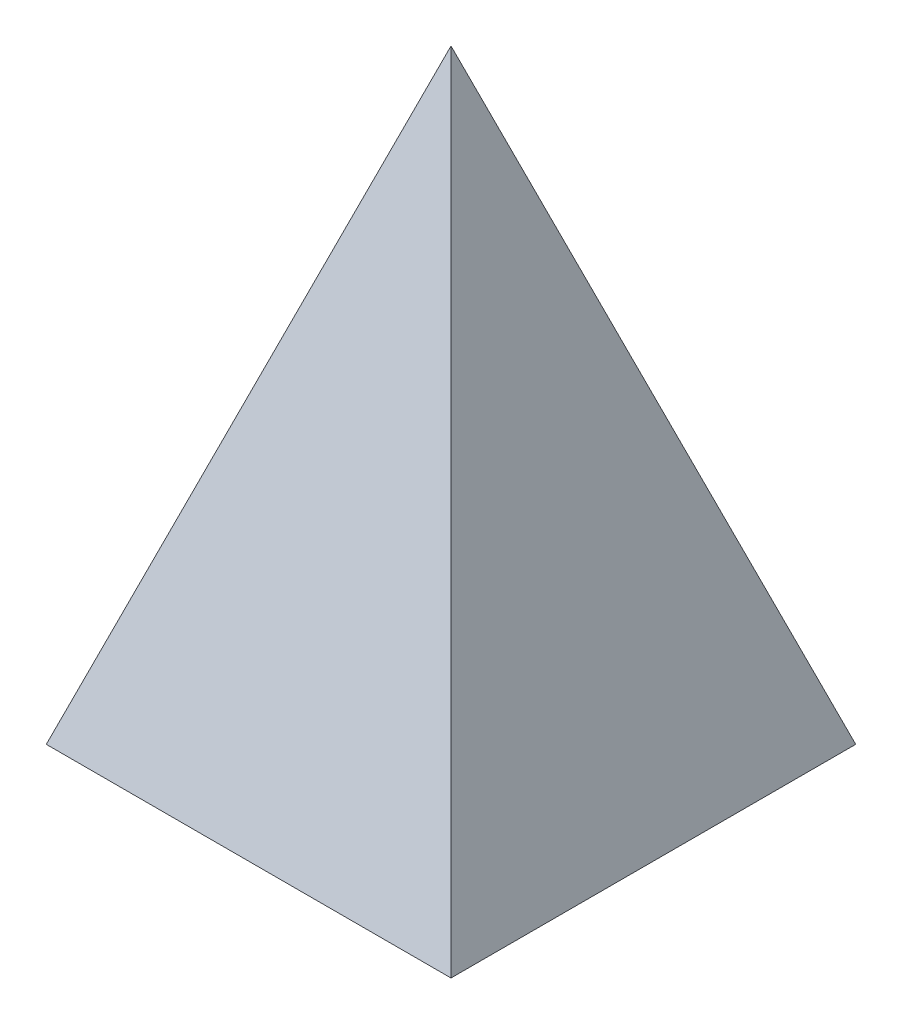
ISO-10303-21;
HEADER;
FILE_DESCRIPTION(('STEP AP214'),'2;1');
FILE_NAME('part.step','',(''),(''),'','','');
FILE_SCHEMA(('AUTOMOTIVE_DESIGN { 1 0 10303 214 1 1 1 1 }'));
ENDSEC;
DATA;
#1=APPLICATION_CONTEXT('core data for automotive mechanical design processes');
#2=APPLICATION_PROTOCOL_DEFINITION('international standard','automotive_design',2000,#1);
#3=PRODUCT_CONTEXT('',#1,'mechanical');
#4=PRODUCT('Part','Part','',(#3));
#5=PRODUCT_RELATED_PRODUCT_CATEGORY('part','',(#4));
#6=PRODUCT_DEFINITION_FORMATION('','',#4);
#7=PRODUCT_DEFINITION_CONTEXT('part definition',#1,'design');
#8=PRODUCT_DEFINITION('design','',#6,#7);
#9=PRODUCT_DEFINITION_SHAPE('','',#8);
#10=(LENGTH_UNIT() NAMED_UNIT(*) SI_UNIT(.MILLI.,.METRE.));
#11=(NAMED_UNIT(*) PLANE_ANGLE_UNIT() SI_UNIT($,.RADIAN.));
#12=(NAMED_UNIT(*) SI_UNIT($,.STERADIAN.) SOLID_ANGLE_UNIT());
#13=UNCERTAINTY_MEASURE_WITH_UNIT(LENGTH_MEASURE(1.E-05),#10,'distance_accuracy_value','');
#14=(GEOMETRIC_REPRESENTATION_CONTEXT(3) GLOBAL_UNCERTAINTY_ASSIGNED_CONTEXT((#13)) GLOBAL_UNIT_ASSIGNED_CONTEXT((#10,
#11,#12)) REPRESENTATION_CONTEXT('',''));
#15=CARTESIAN_POINT('',(0.,0.,0.));
#16=DIRECTION('',(0.,0.,1.));
#17=DIRECTION('',(1.,0.,0.));
#18=AXIS2_PLACEMENT_3D('',#15,#16,#17);
#19=CARTESIAN_POINT('',(0.,0.,0.));
#20=DIRECTION('',(-0.948323655206199,0.317304656405093,0.));
#21=DIRECTION('',(-0.317304656405093,-0.948323655206199,0.));
#22=AXIS2_PLACEMENT_3D('',#19,#20,#21);
#23=PLANE('',#22);
#24=DIRECTION('',(0.,0.,1.));
#25=VECTOR('',#24,1.);
#26=CARTESIAN_POINT('',(0.,0.,0.));
#27=LINE('',#26,#25);
#28=CARTESIAN_POINT('',(0.,0.,-50.));
#29=VERTEX_POINT('',#28);
#30=CARTESIAN_POINT('',(0.,0.,0.));
#31=VERTEX_POINT('',#30);
#32=EDGE_CURVE('E73',#29,#31,#27,.T.);
#33=ORIENTED_EDGE('',*,*,#32,.T.);
#34=DIRECTION('',(-0.302444342389875,-0.903910858167282,0.302444342389875));
#35=VECTOR('',#34,1.);
#36=CARTESIAN_POINT('',(0.,0.,0.));
#37=LINE('',#36,#35);
#38=CARTESIAN_POINT('',(25.,74.7171240685722,-25.));
#39=VERTEX_POINT('',#38);
#40=EDGE_CURVE('E11',#39,#31,#37,.T.);
#41=ORIENTED_EDGE('',*,*,#40,.F.);
#42=DIRECTION('',(-0.302444342389875,-0.903910858167282,-0.302444342389875));
#43=VECTOR('',#42,1.);
#44=CARTESIAN_POINT('',(4.57362901218221,13.6691362538736,-45.4263709878178));
#45=LINE('',#44,#43);
#46=EDGE_CURVE('E58',#39,#29,#45,.T.);
#47=ORIENTED_EDGE('',*,*,#46,.T.);
#48=EDGE_LOOP('',(#33,#41,#47));
#49=FACE_BOUND('',#48,.T.);
#50=ADVANCED_FACE('F36',(#49),#23,.T.);
#51=CARTESIAN_POINT('',(0.,0.,0.));
#52=DIRECTION('',(0.,0.317304656405093,0.948323655206199));
#53=DIRECTION('',(0.,-0.948323655206199,0.317304656405093));
#54=AXIS2_PLACEMENT_3D('',#51,#52,#53);
#55=PLANE('',#54);
#56=DIRECTION('',(1.,0.,0.));
#57=VECTOR('',#56,1.);
#58=CARTESIAN_POINT('',(0.,0.,0.));
#59=LINE('',#58,#57);
#60=CARTESIAN_POINT('',(50.,0.,0.));
#61=VERTEX_POINT('',#60);
#62=EDGE_CURVE('E70',#31,#61,#59,.T.);
#63=ORIENTED_EDGE('',*,*,#62,.T.);
#64=DIRECTION('',(0.302444342389875,-0.903910858167282,0.302444342389875));
#65=VECTOR('',#64,1.);
#66=CARTESIAN_POINT('',(50.,0.,0.));
#67=LINE('',#66,#65);
#68=EDGE_CURVE('E40',#39,#61,#67,.T.);
#69=ORIENTED_EDGE('',*,*,#68,.F.);
#70=ORIENTED_EDGE('',*,*,#40,.T.);
#71=EDGE_LOOP('',(#63,#69,#70));
#72=FACE_BOUND('',#71,.T.);
#73=ADVANCED_FACE('F38',(#72),#55,.T.);
#74=CARTESIAN_POINT('',(50.,0.,0.));
#75=DIRECTION('',(0.948323655206199,0.317304656405093,0.));
#76=DIRECTION('',(-0.317304656405093,0.948323655206199,0.));
#77=AXIS2_PLACEMENT_3D('',#74,#75,#76);
#78=PLANE('',#77);
#79=DIRECTION('',(0.,0.,-1.));
#80=VECTOR('',#79,1.);
#81=CARTESIAN_POINT('',(50.,0.,0.));
#82=LINE('',#81,#80);
#83=CARTESIAN_POINT('',(50.,0.,-50.));
#84=VERTEX_POINT('',#83);
#85=EDGE_CURVE('E75',#61,#84,#82,.T.);
#86=ORIENTED_EDGE('',*,*,#85,.T.);
#87=DIRECTION('',(0.302444342389875,-0.903910858167282,-0.302444342389875));
#88=VECTOR('',#87,1.);
#89=CARTESIAN_POINT('',(45.4263709878178,13.6691362538736,-45.4263709878178));
#90=LINE('',#89,#88);
#91=EDGE_CURVE('E82',#39,#84,#90,.T.);
#92=ORIENTED_EDGE('',*,*,#91,.F.);
#93=ORIENTED_EDGE('',*,*,#68,.T.);
#94=EDGE_LOOP('',(#86,#92,#93));
#95=FACE_BOUND('',#94,.T.);
#96=ADVANCED_FACE('F85',(#95),#78,.T.);
#97=CARTESIAN_POINT('',(0.,0.,-50.));
#98=DIRECTION('',(0.,0.317304656405093,-0.948323655206199));
#99=DIRECTION('',(0.,0.948323655206199,0.317304656405093));
#100=AXIS2_PLACEMENT_3D('',#97,#98,#99);
#101=PLANE('',#100);
#102=DIRECTION('',(-1.,0.,0.));
#103=VECTOR('',#102,1.);
#104=CARTESIAN_POINT('',(0.,0.,-50.));
#105=LINE('',#104,#103);
#106=EDGE_CURVE('E80',#84,#29,#105,.T.);
#107=ORIENTED_EDGE('',*,*,#106,.T.);
#108=ORIENTED_EDGE('',*,*,#46,.F.);
#109=ORIENTED_EDGE('',*,*,#91,.T.);
#110=EDGE_LOOP('',(#107,#108,#109));
#111=FACE_BOUND('',#110,.T.);
#112=ADVANCED_FACE('F86',(#111),#101,.T.);
#113=CARTESIAN_POINT('',(0.,0.,0.));
#114=DIRECTION('',(0.,-1.,0.));
#115=DIRECTION('',(0.,0.,-1.));
#116=AXIS2_PLACEMENT_3D('',#113,#114,#115);
#117=PLANE('',#116);
#118=ORIENTED_EDGE('',*,*,#32,.F.);
#119=ORIENTED_EDGE('',*,*,#106,.F.);
#120=ORIENTED_EDGE('',*,*,#85,.F.);
#121=ORIENTED_EDGE('',*,*,#62,.F.);
#122=EDGE_LOOP('',(#118,#119,#120,#121));
#123=FACE_BOUND('',#122,.T.);
#124=ADVANCED_FACE('F71',(#123),#117,.T.);
#125=CLOSED_SHELL('',(#50,#73,#96,#112,#124));
#126=MANIFOLD_SOLID_BREP('B2',#125);
#127=ADVANCED_BREP_SHAPE_REPRESENTATION('',(#18,#126),#14);
#128=SHAPE_DEFINITION_REPRESENTATION(#9,#127);
ENDSEC;
END-ISO-10303-21;
